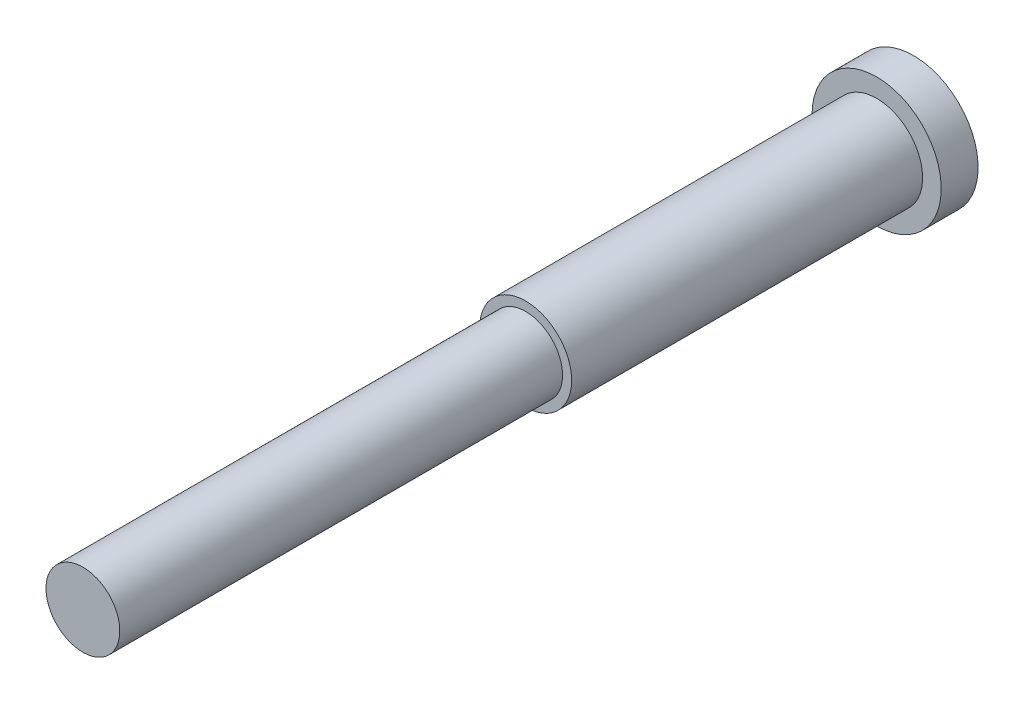
ISO-10303-21;
HEADER;
FILE_DESCRIPTION(('STEP AP214'),'2;1');
FILE_NAME('part.step','',(''),(''),'','','');
FILE_SCHEMA(('AUTOMOTIVE_DESIGN { 1 0 10303 214 1 1 1 1 }'));
ENDSEC;
DATA;
#1=APPLICATION_CONTEXT('core data for automotive mechanical design processes');
#2=APPLICATION_PROTOCOL_DEFINITION('international standard','automotive_design',2000,#1);
#3=PRODUCT_CONTEXT('',#1,'mechanical');
#4=PRODUCT('Part','Part','',(#3));
#5=PRODUCT_RELATED_PRODUCT_CATEGORY('part','',(#4));
#6=PRODUCT_DEFINITION_FORMATION('','',#4);
#7=PRODUCT_DEFINITION_CONTEXT('part definition',#1,'design');
#8=PRODUCT_DEFINITION('design','',#6,#7);
#9=PRODUCT_DEFINITION_SHAPE('','',#8);
#10=(LENGTH_UNIT() NAMED_UNIT(*) SI_UNIT(.MILLI.,.METRE.));
#11=(NAMED_UNIT(*) PLANE_ANGLE_UNIT() SI_UNIT($,.RADIAN.));
#12=(NAMED_UNIT(*) SI_UNIT($,.STERADIAN.) SOLID_ANGLE_UNIT());
#13=UNCERTAINTY_MEASURE_WITH_UNIT(LENGTH_MEASURE(1.E-05),#10,'distance_accuracy_value','');
#14=(GEOMETRIC_REPRESENTATION_CONTEXT(3) GLOBAL_UNCERTAINTY_ASSIGNED_CONTEXT((#13)) GLOBAL_UNIT_ASSIGNED_CONTEXT((#10,
#11,#12)) REPRESENTATION_CONTEXT('',''));
#15=CARTESIAN_POINT('',(0.,0.,0.));
#16=DIRECTION('',(0.,0.,1.));
#17=DIRECTION('',(1.,0.,0.));
#18=AXIS2_PLACEMENT_3D('',#15,#16,#17);
#19=CARTESIAN_POINT('',(0.,0.,60.4012));
#20=DIRECTION('',(0.,0.,-1.));
#21=DIRECTION('',(-1.,0.,0.));
#22=AXIS2_PLACEMENT_3D('',#19,#20,#21);
#23=CYLINDRICAL_SURFACE('',#22,7.9121);
#24=CARTESIAN_POINT('',(0.,0.,60.4012));
#25=DIRECTION('',(0.,0.,1.));
#26=DIRECTION('',(1.,0.,0.));
#27=AXIS2_PLACEMENT_3D('',#24,#25,#26);
#28=CIRCLE('',#27,7.9121);
#29=CARTESIAN_POINT('',(7.9121,0.,60.4012));
#30=VERTEX_POINT('',#29);
#31=EDGE_CURVE('E10',#30,#30,#28,.T.);
#32=ORIENTED_EDGE('',*,*,#31,.F.);
#33=EDGE_LOOP('',(#32));
#34=FACE_BOUND('',#33,.T.);
#35=CARTESIAN_POINT('',(0.,0.,0.));
#36=DIRECTION('',(0.,0.,-1.));
#37=DIRECTION('',(-1.,0.,0.));
#38=AXIS2_PLACEMENT_3D('',#35,#36,#37);
#39=CIRCLE('',#38,7.9121);
#40=CARTESIAN_POINT('',(-7.9121,0.,0.));
#41=VERTEX_POINT('',#40);
#42=EDGE_CURVE('E52',#41,#41,#39,.T.);
#43=ORIENTED_EDGE('',*,*,#42,.F.);
#44=EDGE_LOOP('',(#43));
#45=FACE_BOUND('',#44,.T.);
#46=ADVANCED_FACE('F37',(#34,#45),#23,.T.);
#47=CARTESIAN_POINT('',(0.,0.,60.4012));
#48=DIRECTION('',(0.,0.,1.));
#49=DIRECTION('',(1.,0.,0.));
#50=AXIS2_PLACEMENT_3D('',#47,#48,#49);
#51=PLANE('',#50);
#52=CARTESIAN_POINT('',(0.,0.,60.4012));
#53=DIRECTION('',(0.,0.,1.));
#54=DIRECTION('',(1.,0.,0.));
#55=AXIS2_PLACEMENT_3D('',#52,#53,#54);
#56=CIRCLE('',#55,6.35);
#57=CARTESIAN_POINT('',(-6.35,0.,60.4012));
#58=VERTEX_POINT('',#57);
#59=EDGE_CURVE('E47',#58,#58,#56,.T.);
#60=ORIENTED_EDGE('',*,*,#59,.F.);
#61=EDGE_LOOP('',(#60));
#62=FACE_BOUND('',#61,.T.);
#63=ORIENTED_EDGE('',*,*,#31,.T.);
#64=EDGE_LOOP('',(#63));
#65=FACE_BOUND('',#64,.T.);
#66=ADVANCED_FACE('F81',(#62,#65),#51,.T.);
#67=CARTESIAN_POINT('',(0.,0.,136.6012));
#68=DIRECTION('',(0.,0.,-1.));
#69=DIRECTION('',(-1.,0.,0.));
#70=AXIS2_PLACEMENT_3D('',#67,#68,#69);
#71=CYLINDRICAL_SURFACE('',#70,6.35);
#72=CARTESIAN_POINT('',(0.,0.,136.6012));
#73=DIRECTION('',(0.,0.,1.));
#74=DIRECTION('',(1.,0.,0.));
#75=AXIS2_PLACEMENT_3D('',#72,#73,#74);
#76=CIRCLE('',#75,6.35);
#77=CARTESIAN_POINT('',(-6.35,0.,136.6012));
#78=VERTEX_POINT('',#77);
#79=EDGE_CURVE('E43',#78,#78,#76,.T.);
#80=CARTESIAN_POINT('',(-6.35,0.,136.6012));
#81=CARTESIAN_POINT('',(-6.35,0.,135.80745));
#82=CARTESIAN_POINT('',(-6.35,0.,135.0137));
#83=CARTESIAN_POINT('',(-6.35,0.,133.4262));
#84=CARTESIAN_POINT('',(-6.35,0.,132.63245));
#85=CARTESIAN_POINT('',(-6.35,0.,131.04495));
#86=CARTESIAN_POINT('',(-6.35,0.,130.2512));
#87=CARTESIAN_POINT('',(-6.35,0.,128.6637));
#88=CARTESIAN_POINT('',(-6.35,0.,127.86995));
#89=CARTESIAN_POINT('',(-6.35,0.,126.28245));
#90=CARTESIAN_POINT('',(-6.35,0.,125.4887));
#91=CARTESIAN_POINT('',(-6.35,0.,123.9012));
#92=CARTESIAN_POINT('',(-6.35,0.,123.10745));
#93=CARTESIAN_POINT('',(-6.35,0.,121.51995));
#94=CARTESIAN_POINT('',(-6.35,0.,120.7262));
#95=CARTESIAN_POINT('',(-6.35,0.,119.1387));
#96=CARTESIAN_POINT('',(-6.35,0.,118.34495));
#97=CARTESIAN_POINT('',(-6.35,0.,116.75745));
#98=CARTESIAN_POINT('',(-6.35,0.,115.9637));
#99=CARTESIAN_POINT('',(-6.35,0.,114.3762));
#100=CARTESIAN_POINT('',(-6.35,0.,113.58245));
#101=CARTESIAN_POINT('',(-6.35,0.,111.99495));
#102=CARTESIAN_POINT('',(-6.35,0.,111.2012));
#103=CARTESIAN_POINT('',(-6.35,0.,109.6137));
#104=CARTESIAN_POINT('',(-6.35,0.,108.81995));
#105=CARTESIAN_POINT('',(-6.35,0.,107.23245));
#106=CARTESIAN_POINT('',(-6.35,0.,106.4387));
#107=CARTESIAN_POINT('',(-6.35,0.,104.8512));
#108=CARTESIAN_POINT('',(-6.35,0.,104.05745));
#109=CARTESIAN_POINT('',(-6.35,0.,102.46995));
#110=CARTESIAN_POINT('',(-6.35,0.,101.6762));
#111=CARTESIAN_POINT('',(-6.35,0.,100.0887));
#112=CARTESIAN_POINT('',(-6.35,0.,99.29495));
#113=CARTESIAN_POINT('',(-6.35,0.,97.70745));
#114=CARTESIAN_POINT('',(-6.35,0.,96.9137));
#115=CARTESIAN_POINT('',(-6.35,0.,95.3262));
#116=CARTESIAN_POINT('',(-6.35,0.,94.53245));
#117=CARTESIAN_POINT('',(-6.35,0.,92.94495));
#118=CARTESIAN_POINT('',(-6.35,0.,92.1512));
#119=CARTESIAN_POINT('',(-6.35,0.,90.5637));
#120=CARTESIAN_POINT('',(-6.35,0.,89.76995));
#121=CARTESIAN_POINT('',(-6.35,0.,88.18245));
#122=CARTESIAN_POINT('',(-6.35,0.,87.3887));
#123=CARTESIAN_POINT('',(-6.35,0.,85.8012));
#124=CARTESIAN_POINT('',(-6.35,0.,85.00745));
#125=CARTESIAN_POINT('',(-6.35,0.,83.41995));
#126=CARTESIAN_POINT('',(-6.35,0.,82.6262));
#127=CARTESIAN_POINT('',(-6.35,0.,81.0387));
#128=CARTESIAN_POINT('',(-6.35,0.,80.24495));
#129=CARTESIAN_POINT('',(-6.35,0.,78.65745));
#130=CARTESIAN_POINT('',(-6.35,0.,77.8637));
#131=CARTESIAN_POINT('',(-6.35,0.,76.2762));
#132=CARTESIAN_POINT('',(-6.35,0.,75.48245));
#133=CARTESIAN_POINT('',(-6.35,0.,73.89495));
#134=CARTESIAN_POINT('',(-6.35,0.,73.1012));
#135=CARTESIAN_POINT('',(-6.35,0.,71.5137));
#136=CARTESIAN_POINT('',(-6.35,0.,70.71995));
#137=CARTESIAN_POINT('',(-6.35,0.,69.13245));
#138=CARTESIAN_POINT('',(-6.35,0.,68.3387));
#139=CARTESIAN_POINT('',(-6.35,0.,66.7512));
#140=CARTESIAN_POINT('',(-6.35,0.,65.95745));
#141=CARTESIAN_POINT('',(-6.35,0.,64.36995));
#142=CARTESIAN_POINT('',(-6.35,0.,63.5762));
#143=CARTESIAN_POINT('',(-6.35,0.,61.9887));
#144=CARTESIAN_POINT('',(-6.35,0.,61.19495));
#145=CARTESIAN_POINT('',(-6.35,0.,60.4012));
#146=B_SPLINE_CURVE_WITH_KNOTS('',3,(#80,#81,#82,#83,#84,#85,#86,#87,#88,#89,#90,#91,#92,#93,
#94,#95,#96,#97,#98,#99,#100,#101,#102,#103,#104,#105,#106,#107,#108,#109,#110,#111,#112,#113,
#114,#115,#116,#117,#118,#119,#120,#121,#122,#123,#124,#125,#126,#127,#128,#129,#130,#131,#132,
#133,#134,#135,#136,#137,#138,#139,#140,#141,#142,#143,#144,#145),.UNSPECIFIED.,.F.,.F.,(4,2,2,
2,2,2,2,2,2,2,2,2,2,2,2,2,2,2,2,2,2,2,2,2,2,2,2,2,2,2,2,2,4),(0.,2.38124999999997,
4.76249999999998,7.14374999999998,9.52499999999998,11.90625,14.2875,16.66875,19.05,21.43125,
23.8125,26.19375,28.575,30.95625,33.3375,35.71875,38.1,40.48125,42.8625,45.24375,47.625,
50.00625,52.3875,54.76875,57.15,59.53125,61.9125,64.29375,66.675,69.05625,71.4375,73.81875,
76.2),.UNSPECIFIED.);
#147=EDGE_CURVE('BSEAM86',#78,#58,#146,.T.);
#148=ORIENTED_EDGE('',*,*,#79,.F.);
#149=ORIENTED_EDGE('',*,*,#59,.T.);
#150=ORIENTED_EDGE('',*,*,#147,.T.);
#151=ORIENTED_EDGE('',*,*,#147,.F.);
#152=EDGE_LOOP('',(#148,#150,#149,#151));
#153=FACE_BOUND('',#152,.T.);
#154=ADVANCED_FACE('F86',(#153),#71,.T.);
#155=CARTESIAN_POINT('',(0.,0.,136.6012));
#156=DIRECTION('',(0.,0.,1.));
#157=DIRECTION('',(1.,0.,0.));
#158=AXIS2_PLACEMENT_3D('',#155,#156,#157);
#159=PLANE('',#158);
#160=ORIENTED_EDGE('',*,*,#79,.T.);
#161=EDGE_LOOP('',(#160));
#162=FACE_BOUND('',#161,.T.);
#163=ADVANCED_FACE('F68',(#162),#159,.T.);
#164=CARTESIAN_POINT('',(0.,0.,-6.35));
#165=DIRECTION('',(0.,0.,1.));
#166=DIRECTION('',(1.,0.,0.));
#167=AXIS2_PLACEMENT_3D('',#164,#165,#166);
#168=CYLINDRICAL_SURFACE('',#167,11.1125);
#169=CARTESIAN_POINT('',(0.,0.,-6.35));
#170=DIRECTION('',(0.,0.,-1.));
#171=DIRECTION('',(-1.,0.,0.));
#172=AXIS2_PLACEMENT_3D('',#169,#170,#171);
#173=CIRCLE('',#172,11.1125);
#174=CARTESIAN_POINT('',(-11.1125,0.,-6.35));
#175=VERTEX_POINT('',#174);
#176=EDGE_CURVE('E56',#175,#175,#173,.T.);
#177=ORIENTED_EDGE('',*,*,#176,.F.);
#178=EDGE_LOOP('',(#177));
#179=FACE_BOUND('',#178,.T.);
#180=CARTESIAN_POINT('',(0.,0.,0.));
#181=DIRECTION('',(0.,0.,-1.));
#182=DIRECTION('',(-1.,0.,0.));
#183=AXIS2_PLACEMENT_3D('',#180,#181,#182);
#184=CIRCLE('',#183,11.1125);
#185=CARTESIAN_POINT('',(-11.1125,0.,0.));
#186=VERTEX_POINT('',#185);
#187=EDGE_CURVE('E57',#186,#186,#184,.T.);
#188=ORIENTED_EDGE('',*,*,#187,.T.);
#189=EDGE_LOOP('',(#188));
#190=FACE_BOUND('',#189,.T.);
#191=ADVANCED_FACE('F65',(#179,#190),#168,.T.);
#192=CARTESIAN_POINT('',(0.,0.,-6.35));
#193=DIRECTION('',(0.,0.,-1.));
#194=DIRECTION('',(-1.,0.,0.));
#195=AXIS2_PLACEMENT_3D('',#192,#193,#194);
#196=PLANE('',#195);
#197=ORIENTED_EDGE('',*,*,#176,.T.);
#198=EDGE_LOOP('',(#197));
#199=FACE_BOUND('',#198,.T.);
#200=ADVANCED_FACE('F63',(#199),#196,.T.);
#201=CARTESIAN_POINT('',(0.,0.,0.));
#202=DIRECTION('',(0.,0.,-1.));
#203=DIRECTION('',(-1.,0.,0.));
#204=AXIS2_PLACEMENT_3D('',#201,#202,#203);
#205=PLANE('',#204);
#206=ORIENTED_EDGE('',*,*,#42,.T.);
#207=EDGE_LOOP('',(#206));
#208=FACE_BOUND('',#207,.T.);
#209=ORIENTED_EDGE('',*,*,#187,.F.);
#210=EDGE_LOOP('',(#209));
#211=FACE_BOUND('',#210,.T.);
#212=ADVANCED_FACE('F72',(#208,#211),#205,.F.);
#213=CLOSED_SHELL('',(#46,#66,#154,#163,#191,#200,#212));
#214=MANIFOLD_SOLID_BREP('B2',#213);
#215=ADVANCED_BREP_SHAPE_REPRESENTATION('',(#18,#214),#14);
#216=SHAPE_DEFINITION_REPRESENTATION(#9,#215);
ENDSEC;
END-ISO-10303-21;
